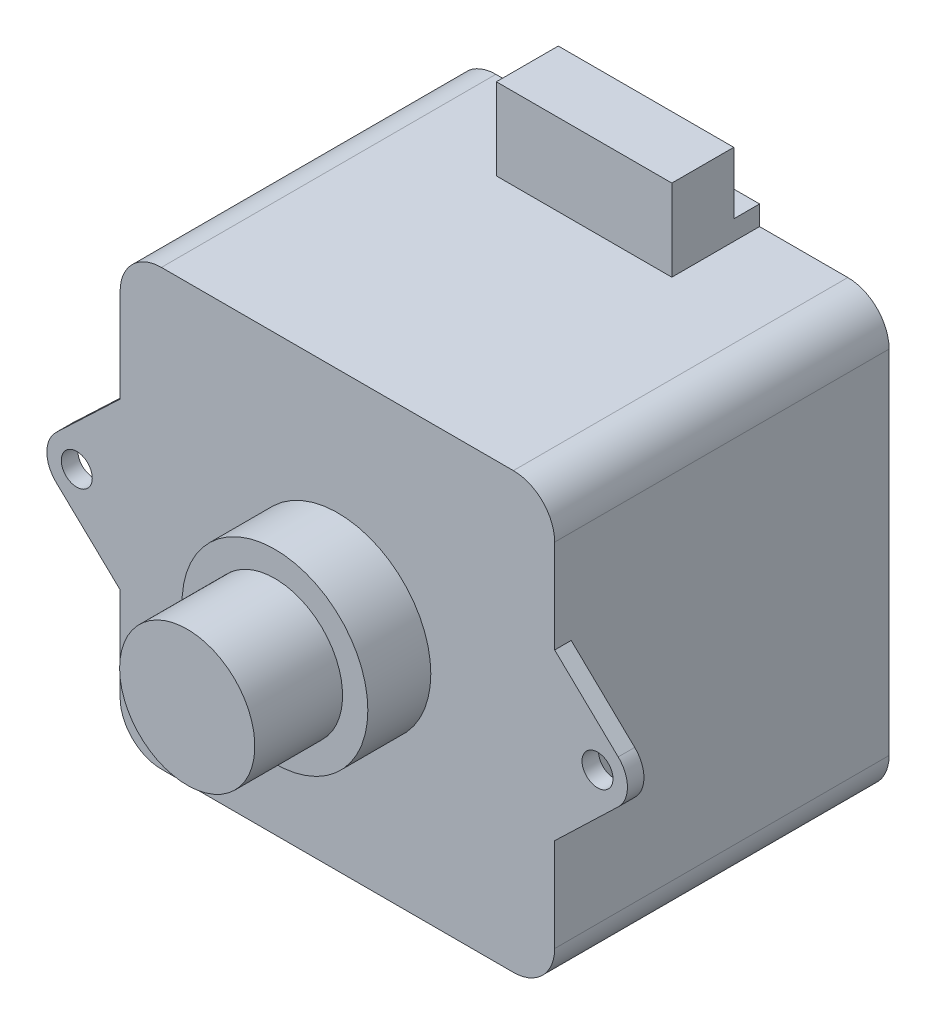
ISO-10303-21;
HEADER;
FILE_DESCRIPTION(('STEP AP214'),'2;1');
FILE_NAME('part.step','',(''),(''),'','','');
FILE_SCHEMA(('AUTOMOTIVE_DESIGN { 1 0 10303 214 1 1 1 1 }'));
ENDSEC;
DATA;
#1=APPLICATION_CONTEXT('core data for automotive mechanical design processes');
#2=APPLICATION_PROTOCOL_DEFINITION('international standard','automotive_design',2000,#1);
#3=PRODUCT_CONTEXT('',#1,'mechanical');
#4=PRODUCT('Part','Part','',(#3));
#5=PRODUCT_RELATED_PRODUCT_CATEGORY('part','',(#4));
#6=PRODUCT_DEFINITION_FORMATION('','',#4);
#7=PRODUCT_DEFINITION_CONTEXT('part definition',#1,'design');
#8=PRODUCT_DEFINITION('design','',#6,#7);
#9=PRODUCT_DEFINITION_SHAPE('','',#8);
#10=(LENGTH_UNIT() NAMED_UNIT(*) SI_UNIT(.MILLI.,.METRE.));
#11=(NAMED_UNIT(*) PLANE_ANGLE_UNIT() SI_UNIT($,.RADIAN.));
#12=(NAMED_UNIT(*) SI_UNIT($,.STERADIAN.) SOLID_ANGLE_UNIT());
#13=UNCERTAINTY_MEASURE_WITH_UNIT(LENGTH_MEASURE(1.E-05),#10,'distance_accuracy_value','');
#14=(GEOMETRIC_REPRESENTATION_CONTEXT(3) GLOBAL_UNCERTAINTY_ASSIGNED_CONTEXT((#13)) GLOBAL_UNIT_ASSIGNED_CONTEXT((#10,
#11,#12)) REPRESENTATION_CONTEXT('',''));
#15=CARTESIAN_POINT('',(0.,0.,0.));
#16=DIRECTION('',(0.,0.,1.));
#17=DIRECTION('',(1.,0.,0.));
#18=AXIS2_PLACEMENT_3D('',#15,#16,#17);
#19=CARTESIAN_POINT('',(-42.1,0.,32.4));
#20=DIRECTION('',(1.,0.,0.));
#21=DIRECTION('',(0.,0.,-1.));
#22=AXIS2_PLACEMENT_3D('',#19,#20,#21);
#23=PLANE('',#22);
#24=DIRECTION('',(0.,-1.,0.));
#25=VECTOR('',#24,1.);
#26=CARTESIAN_POINT('',(-42.1,0.,0.));
#27=LINE('',#26,#25);
#28=CARTESIAN_POINT('',(-42.1,38.1,0.));
#29=VERTEX_POINT('',#28);
#30=CARTESIAN_POINT('',(-42.1,4.,0.));
#31=VERTEX_POINT('',#30);
#32=EDGE_CURVE('E193',#29,#31,#27,.T.);
#33=ORIENTED_EDGE('',*,*,#32,.T.);
#34=DIRECTION('',(0.,0.,-1.));
#35=VECTOR('',#34,1.);
#36=CARTESIAN_POINT('',(-42.1,4.,40.));
#37=LINE('',#36,#35);
#38=CARTESIAN_POINT('',(-42.1,4.,32.4));
#39=VERTEX_POINT('',#38);
#40=EDGE_CURVE('E57',#39,#31,#37,.T.);
#41=ORIENTED_EDGE('',*,*,#40,.F.);
#42=DIRECTION('',(0.,-1.,0.));
#43=VECTOR('',#42,1.);
#44=CARTESIAN_POINT('',(-42.1,0.,32.4));
#45=LINE('',#44,#43);
#46=CARTESIAN_POINT('',(-42.1,13.05,32.4));
#47=VERTEX_POINT('',#46);
#48=EDGE_CURVE('E309',#47,#39,#45,.T.);
#49=ORIENTED_EDGE('',*,*,#48,.F.);
#50=DIRECTION('',(0.,0.,1.));
#51=VECTOR('',#50,1.);
#52=CARTESIAN_POINT('',(-42.1,13.05,30.8));
#53=LINE('',#52,#51);
#54=CARTESIAN_POINT('',(-42.1,13.05,30.8));
#55=VERTEX_POINT('',#54);
#56=EDGE_CURVE('E268',#55,#47,#53,.T.);
#57=ORIENTED_EDGE('',*,*,#56,.F.);
#58=DIRECTION('',(0.,-1.,0.));
#59=VECTOR('',#58,1.);
#60=CARTESIAN_POINT('',(-42.1,21.05,30.8));
#61=LINE('',#60,#59);
#62=CARTESIAN_POINT('',(-42.1,29.05,30.8));
#63=VERTEX_POINT('',#62);
#64=EDGE_CURVE('E265',#63,#55,#61,.T.);
#65=ORIENTED_EDGE('',*,*,#64,.F.);
#66=DIRECTION('',(0.,0.,-1.));
#67=VECTOR('',#66,1.);
#68=CARTESIAN_POINT('',(-42.1,29.05,32.4));
#69=LINE('',#68,#67);
#70=CARTESIAN_POINT('',(-42.1,29.05,32.4));
#71=VERTEX_POINT('',#70);
#72=EDGE_CURVE('E217',#71,#63,#69,.T.);
#73=ORIENTED_EDGE('',*,*,#72,.F.);
#74=CARTESIAN_POINT('',(-42.1,38.1,32.4));
#75=VERTEX_POINT('',#74);
#76=EDGE_CURVE('E195',#75,#71,#45,.T.);
#77=ORIENTED_EDGE('',*,*,#76,.F.);
#78=DIRECTION('',(0.,0.,-1.));
#79=VECTOR('',#78,1.);
#80=CARTESIAN_POINT('',(-42.1,38.1,40.));
#81=LINE('',#80,#79);
#82=EDGE_CURVE('E183',#75,#29,#81,.T.);
#83=ORIENTED_EDGE('',*,*,#82,.T.);
#84=EDGE_LOOP('',(#33,#41,#49,#57,#65,#73,#77,#83));
#85=FACE_BOUND('',#84,.T.);
#86=ADVANCED_FACE('F33',(#85),#23,.F.);
#87=CARTESIAN_POINT('',(0.,0.,32.4));
#88=DIRECTION('',(-1.,0.,0.));
#89=DIRECTION('',(0.,-1.,0.));
#90=AXIS2_PLACEMENT_3D('',#87,#88,#89);
#91=PLANE('',#90);
#92=DIRECTION('',(0.,1.,0.));
#93=VECTOR('',#92,1.);
#94=CARTESIAN_POINT('',(0.,0.,0.));
#95=LINE('',#94,#93);
#96=CARTESIAN_POINT('',(0.,4.,0.));
#97=VERTEX_POINT('',#96);
#98=CARTESIAN_POINT('',(0.,38.1,0.));
#99=VERTEX_POINT('',#98);
#100=EDGE_CURVE('E303',#97,#99,#95,.T.);
#101=ORIENTED_EDGE('',*,*,#100,.T.);
#102=DIRECTION('',(0.,0.,-1.));
#103=VECTOR('',#102,1.);
#104=CARTESIAN_POINT('',(0.,38.1,40.));
#105=LINE('',#104,#103);
#106=CARTESIAN_POINT('',(0.,38.1,32.4));
#107=VERTEX_POINT('',#106);
#108=EDGE_CURVE('E390',#107,#99,#105,.T.);
#109=ORIENTED_EDGE('',*,*,#108,.F.);
#110=DIRECTION('',(0.,1.,0.));
#111=VECTOR('',#110,1.);
#112=CARTESIAN_POINT('',(0.,0.,32.4));
#113=LINE('',#112,#111);
#114=CARTESIAN_POINT('',(0.,29.05,32.4));
#115=VERTEX_POINT('',#114);
#116=EDGE_CURVE('E204',#115,#107,#113,.T.);
#117=ORIENTED_EDGE('',*,*,#116,.F.);
#118=DIRECTION('',(0.,0.,1.));
#119=VECTOR('',#118,1.);
#120=CARTESIAN_POINT('',(0.,29.05,32.4));
#121=LINE('',#120,#119);
#122=CARTESIAN_POINT('',(0.,29.05,30.8));
#123=VERTEX_POINT('',#122);
#124=EDGE_CURVE('E274',#123,#115,#121,.T.);
#125=ORIENTED_EDGE('',*,*,#124,.F.);
#126=DIRECTION('',(0.,1.,0.));
#127=VECTOR('',#126,1.);
#128=CARTESIAN_POINT('',(0.,21.05,30.8));
#129=LINE('',#128,#127);
#130=CARTESIAN_POINT('',(0.,13.05,30.8));
#131=VERTEX_POINT('',#130);
#132=EDGE_CURVE('E272',#131,#123,#129,.T.);
#133=ORIENTED_EDGE('',*,*,#132,.F.);
#134=DIRECTION('',(0.,0.,-1.));
#135=VECTOR('',#134,1.);
#136=CARTESIAN_POINT('',(0.,13.05,32.4));
#137=LINE('',#136,#135);
#138=CARTESIAN_POINT('',(0.,13.05,32.4));
#139=VERTEX_POINT('',#138);
#140=EDGE_CURVE('E270',#139,#131,#137,.T.);
#141=ORIENTED_EDGE('',*,*,#140,.F.);
#142=CARTESIAN_POINT('',(0.,4.,32.4));
#143=VERTEX_POINT('',#142);
#144=EDGE_CURVE('E304',#143,#139,#113,.T.);
#145=ORIENTED_EDGE('',*,*,#144,.F.);
#146=DIRECTION('',(0.,0.,-1.));
#147=VECTOR('',#146,1.);
#148=CARTESIAN_POINT('',(0.,4.,40.));
#149=LINE('',#148,#147);
#150=EDGE_CURVE('E412',#143,#97,#149,.T.);
#151=ORIENTED_EDGE('',*,*,#150,.T.);
#152=EDGE_LOOP('',(#101,#109,#117,#125,#133,#141,#145,#151));
#153=FACE_BOUND('',#152,.T.);
#154=ADVANCED_FACE('F35',(#153),#91,.F.);
#155=CARTESIAN_POINT('',(0.,42.1,32.4));
#156=DIRECTION('',(0.,-1.,0.));
#157=DIRECTION('',(1.,0.,0.));
#158=AXIS2_PLACEMENT_3D('',#155,#156,#157);
#159=PLANE('',#158);
#160=DIRECTION('',(0.,0.,-1.));
#161=VECTOR('',#160,1.);
#162=CARTESIAN_POINT('',(-4.,42.1,40.));
#163=LINE('',#162,#161);
#164=CARTESIAN_POINT('',(-4.,42.1,32.4));
#165=VERTEX_POINT('',#164);
#166=CARTESIAN_POINT('',(-4.,42.1,0.));
#167=VERTEX_POINT('',#166);
#168=EDGE_CURVE('E388',#165,#167,#163,.T.);
#169=ORIENTED_EDGE('',*,*,#168,.T.);
#170=DIRECTION('',(-1.,0.,0.));
#171=VECTOR('',#170,1.);
#172=CARTESIAN_POINT('',(0.,42.1,0.));
#173=LINE('',#172,#171);
#174=CARTESIAN_POINT('',(-12.55,42.1,0.));
#175=VERTEX_POINT('',#174);
#176=EDGE_CURVE('E201',#167,#175,#173,.T.);
#177=ORIENTED_EDGE('',*,*,#176,.T.);
#178=DIRECTION('',(0.,0.,-1.));
#179=VECTOR('',#178,1.);
#180=CARTESIAN_POINT('',(-12.55,42.1,0.));
#181=LINE('',#180,#179);
#182=CARTESIAN_POINT('',(-12.55,42.1,8.5));
#183=VERTEX_POINT('',#182);
#184=EDGE_CURVE('E280',#183,#175,#181,.T.);
#185=ORIENTED_EDGE('',*,*,#184,.F.);
#186=DIRECTION('',(1.,0.,0.));
#187=VECTOR('',#186,1.);
#188=CARTESIAN_POINT('',(-29.55,42.1,8.5));
#189=LINE('',#188,#187);
#190=CARTESIAN_POINT('',(-29.55,42.1,8.5));
#191=VERTEX_POINT('',#190);
#192=EDGE_CURVE('E288',#191,#183,#189,.T.);
#193=ORIENTED_EDGE('',*,*,#192,.F.);
#194=DIRECTION('',(0.,0.,1.));
#195=VECTOR('',#194,1.);
#196=CARTESIAN_POINT('',(-29.55,42.1,0.));
#197=LINE('',#196,#195);
#198=CARTESIAN_POINT('',(-29.55,42.1,0.));
#199=VERTEX_POINT('',#198);
#200=EDGE_CURVE('E276',#199,#191,#197,.T.);
#201=ORIENTED_EDGE('',*,*,#200,.F.);
#202=CARTESIAN_POINT('',(-38.1,42.1,0.));
#203=VERTEX_POINT('',#202);
#204=EDGE_CURVE('E206',#199,#203,#173,.T.);
#205=ORIENTED_EDGE('',*,*,#204,.T.);
#206=DIRECTION('',(0.,0.,-1.));
#207=VECTOR('',#206,1.);
#208=CARTESIAN_POINT('',(-38.1,42.1,40.));
#209=LINE('',#208,#207);
#210=CARTESIAN_POINT('',(-38.1,42.1,32.4));
#211=VERTEX_POINT('',#210);
#212=EDGE_CURVE('E49',#211,#203,#209,.T.);
#213=ORIENTED_EDGE('',*,*,#212,.F.);
#214=DIRECTION('',(-1.,0.,0.));
#215=VECTOR('',#214,1.);
#216=CARTESIAN_POINT('',(0.,42.1,32.4));
#217=LINE('',#216,#215);
#218=EDGE_CURVE('E306',#165,#211,#217,.T.);
#219=ORIENTED_EDGE('',*,*,#218,.F.);
#220=EDGE_LOOP('',(#169,#177,#185,#193,#201,#205,#213,#219));
#221=FACE_BOUND('',#220,.T.);
#222=ADVANCED_FACE('F320',(#221),#159,.F.);
#223=CARTESIAN_POINT('',(0.,0.,32.4));
#224=DIRECTION('',(0.,1.,0.));
#225=DIRECTION('',(0.,0.,1.));
#226=AXIS2_PLACEMENT_3D('',#223,#224,#225);
#227=PLANE('',#226);
#228=DIRECTION('',(0.,0.,-1.));
#229=VECTOR('',#228,1.);
#230=CARTESIAN_POINT('',(-38.1,0.,40.));
#231=LINE('',#230,#229);
#232=CARTESIAN_POINT('',(-38.1,0.,32.4));
#233=VERTEX_POINT('',#232);
#234=CARTESIAN_POINT('',(-38.1,0.,0.));
#235=VERTEX_POINT('',#234);
#236=EDGE_CURVE('E420',#233,#235,#231,.T.);
#237=ORIENTED_EDGE('',*,*,#236,.T.);
#238=DIRECTION('',(1.,0.,0.));
#239=VECTOR('',#238,1.);
#240=CARTESIAN_POINT('',(0.,0.,0.));
#241=LINE('',#240,#239);
#242=CARTESIAN_POINT('',(-4.,0.,0.));
#243=VERTEX_POINT('',#242);
#244=EDGE_CURVE('E200',#235,#243,#241,.T.);
#245=ORIENTED_EDGE('',*,*,#244,.T.);
#246=DIRECTION('',(0.,0.,-1.));
#247=VECTOR('',#246,1.);
#248=CARTESIAN_POINT('',(-4.,0.,40.));
#249=LINE('',#248,#247);
#250=CARTESIAN_POINT('',(-4.,0.,32.4));
#251=VERTEX_POINT('',#250);
#252=EDGE_CURVE('E413',#251,#243,#249,.T.);
#253=ORIENTED_EDGE('',*,*,#252,.F.);
#254=DIRECTION('',(1.,0.,0.));
#255=VECTOR('',#254,1.);
#256=CARTESIAN_POINT('',(0.,0.,32.4));
#257=LINE('',#256,#255);
#258=EDGE_CURVE('E222',#233,#251,#257,.T.);
#259=ORIENTED_EDGE('',*,*,#258,.F.);
#260=EDGE_LOOP('',(#237,#245,#253,#259));
#261=FACE_BOUND('',#260,.T.);
#262=ADVANCED_FACE('F428',(#261),#227,.F.);
#263=CARTESIAN_POINT('',(0.,0.,32.4));
#264=DIRECTION('',(0.,0.,1.));
#265=DIRECTION('',(1.,0.,0.));
#266=AXIS2_PLACEMENT_3D('',#263,#264,#265);
#267=PLANE('',#266);
#268=CARTESIAN_POINT('',(-21.,21.05,32.4));
#269=DIRECTION('',(0.,0.,1.));
#270=DIRECTION('',(1.,0.,0.));
#271=AXIS2_PLACEMENT_3D('',#268,#269,#270);
#272=CIRCLE('',#271,9.);
#273=CARTESIAN_POINT('',(-12.,21.05,32.4));
#274=VERTEX_POINT('',#273);
#275=EDGE_CURVE('E350',#274,#274,#272,.T.);
#276=ORIENTED_EDGE('',*,*,#275,.F.);
#277=EDGE_LOOP('',(#276));
#278=FACE_BOUND('',#277,.T.);
#279=CARTESIAN_POINT('',(-46.3,21.0607022985956,32.4));
#280=DIRECTION('',(0.,0.,1.));
#281=DIRECTION('',(1.,0.,0.));
#282=AXIS2_PLACEMENT_3D('',#279,#280,#281);
#283=CIRCLE('',#282,1.5);
#284=CARTESIAN_POINT('',(-44.8,21.0607022985956,32.4));
#285=VERTEX_POINT('',#284);
#286=EDGE_CURVE('E214',#285,#285,#283,.T.);
#287=ORIENTED_EDGE('',*,*,#286,.F.);
#288=EDGE_LOOP('',(#287));
#289=FACE_BOUND('',#288,.T.);
#290=CARTESIAN_POINT('',(4.15,21.0607022985956,32.4));
#291=DIRECTION('',(0.,0.,1.));
#292=DIRECTION('',(1.,0.,0.));
#293=AXIS2_PLACEMENT_3D('',#290,#291,#292);
#294=CIRCLE('',#293,1.5);
#295=CARTESIAN_POINT('',(5.65,21.0607022985956,32.4));
#296=VERTEX_POINT('',#295);
#297=EDGE_CURVE('E259',#296,#296,#294,.T.);
#298=ORIENTED_EDGE('',*,*,#297,.F.);
#299=EDGE_LOOP('',(#298));
#300=FACE_BOUND('',#299,.T.);
#301=CARTESIAN_POINT('',(-38.1,4.,32.4));
#302=DIRECTION('',(0.,0.,1.));
#303=DIRECTION('',(1.,0.,0.));
#304=AXIS2_PLACEMENT_3D('',#301,#302,#303);
#305=CIRCLE('',#304,4.00000000000001);
#306=EDGE_CURVE('E346',#233,#39,#305,.F.);
#307=ORIENTED_EDGE('',*,*,#306,.F.);
#308=ORIENTED_EDGE('',*,*,#258,.T.);
#309=CARTESIAN_POINT('',(-4.,4.,32.4));
#310=DIRECTION('',(0.,0.,1.));
#311=DIRECTION('',(1.,0.,0.));
#312=AXIS2_PLACEMENT_3D('',#309,#310,#311);
#313=CIRCLE('',#312,4.);
#314=EDGE_CURVE('E410',#143,#251,#313,.F.);
#315=ORIENTED_EDGE('',*,*,#314,.F.);
#316=ORIENTED_EDGE('',*,*,#144,.T.);
#317=DIRECTION('',(-0.720997092131142,-0.692938087521848,0.));
#318=VECTOR('',#317,1.);
#319=CARTESIAN_POINT('',(0.,13.05,32.4));
#320=LINE('',#319,#318);
#321=CARTESIAN_POINT('',(6.15952045381336,18.9698107314153,32.4));
#322=VERTEX_POINT('',#321);
#323=EDGE_CURVE('E246',#322,#139,#320,.T.);
#324=ORIENTED_EDGE('',*,*,#323,.F.);
#325=CARTESIAN_POINT('',(4.15,21.0607022985956,32.4));
#326=DIRECTION('',(0.,0.,-1.));
#327=DIRECTION('',(1.,0.,0.));
#328=AXIS2_PLACEMENT_3D('',#325,#326,#327);
#329=CIRCLE('',#328,2.9);
#330=CARTESIAN_POINT('',(6.15573233203672,23.1552279757412,32.4));
#331=VERTEX_POINT('',#330);
#332=EDGE_CURVE('E251',#331,#322,#329,.T.);
#333=ORIENTED_EDGE('',*,*,#332,.F.);
#334=DIRECTION('',(0.722250233498506,-0.691631838633354,0.));
#335=VECTOR('',#334,1.);
#336=CARTESIAN_POINT('',(0.,29.05,32.4));
#337=LINE('',#336,#335);
#338=EDGE_CURVE('E244',#115,#331,#337,.T.);
#339=ORIENTED_EDGE('',*,*,#338,.F.);
#340=ORIENTED_EDGE('',*,*,#116,.T.);
#341=CARTESIAN_POINT('',(-4.,38.1,32.4));
#342=DIRECTION('',(0.,0.,1.));
#343=DIRECTION('',(1.,0.,0.));
#344=AXIS2_PLACEMENT_3D('',#341,#342,#343);
#345=CIRCLE('',#344,4.);
#346=EDGE_CURVE('E384',#165,#107,#345,.F.);
#347=ORIENTED_EDGE('',*,*,#346,.F.);
#348=ORIENTED_EDGE('',*,*,#218,.T.);
#349=CARTESIAN_POINT('',(-38.1,38.1,32.4));
#350=DIRECTION('',(0.,0.,1.));
#351=DIRECTION('',(1.,0.,0.));
#352=AXIS2_PLACEMENT_3D('',#349,#350,#351);
#353=CIRCLE('',#352,4.);
#354=EDGE_CURVE('E386',#75,#211,#353,.F.);
#355=ORIENTED_EDGE('',*,*,#354,.F.);
#356=ORIENTED_EDGE('',*,*,#76,.T.);
#357=DIRECTION('',(0.725040642809056,0.688706081195041,0.));
#358=VECTOR('',#357,1.);
#359=CARTESIAN_POINT('',(-42.1,29.05,32.4));
#360=LINE('',#359,#358);
#361=CARTESIAN_POINT('',(-48.2972476354656,23.1633201627418,32.4));
#362=VERTEX_POINT('',#361);
#363=EDGE_CURVE('E365',#362,#71,#360,.T.);
#364=ORIENTED_EDGE('',*,*,#363,.F.);
#365=CARTESIAN_POINT('',(-46.3,21.0607022985956,32.4));
#366=DIRECTION('',(0.,0.,-1.));
#367=DIRECTION('',(1.,0.,0.));
#368=AXIS2_PLACEMENT_3D('',#365,#366,#367);
#369=CIRCLE('',#368,2.90000000000001);
#370=CARTESIAN_POINT('',(-48.301054233602,18.9617068354791,32.4));
#371=VERTEX_POINT('',#370);
#372=EDGE_CURVE('E362',#371,#362,#369,.T.);
#373=ORIENTED_EDGE('',*,*,#372,.F.);
#374=DIRECTION('',(-0.723791539005669,0.690018701242079,0.));
#375=VECTOR('',#374,1.);
#376=CARTESIAN_POINT('',(-42.1,13.05,32.4));
#377=LINE('',#376,#375);
#378=EDGE_CURVE('E248',#47,#371,#377,.T.);
#379=ORIENTED_EDGE('',*,*,#378,.F.);
#380=ORIENTED_EDGE('',*,*,#48,.T.);
#381=EDGE_LOOP('',(#307,#308,#315,#316,#324,#333,#339,#340,#347,#348,#355,#356,#364,#373,#379,#380));
#382=FACE_BOUND('',#381,.T.);
#383=ADVANCED_FACE('F375',(#278,#289,#300,#382),#267,.T.);
#384=CARTESIAN_POINT('',(0.,0.,0.));
#385=DIRECTION('',(0.,0.,1.));
#386=DIRECTION('',(1.,0.,0.));
#387=AXIS2_PLACEMENT_3D('',#384,#385,#386);
#388=PLANE('',#387);
#389=ORIENTED_EDGE('',*,*,#244,.F.);
#390=CARTESIAN_POINT('',(-38.1,4.,0.));
#391=DIRECTION('',(0.,0.,1.));
#392=DIRECTION('',(-1.,0.,0.));
#393=AXIS2_PLACEMENT_3D('',#390,#391,#392);
#394=CIRCLE('',#393,4.00000000000001);
#395=EDGE_CURVE('E199',#31,#235,#394,.T.);
#396=ORIENTED_EDGE('',*,*,#395,.F.);
#397=ORIENTED_EDGE('',*,*,#32,.F.);
#398=CARTESIAN_POINT('',(-38.1,38.1,0.));
#399=DIRECTION('',(0.,0.,1.));
#400=DIRECTION('',(-1.,0.,0.));
#401=AXIS2_PLACEMENT_3D('',#398,#399,#400);
#402=CIRCLE('',#401,4.);
#403=EDGE_CURVE('E180',#203,#29,#402,.T.);
#404=ORIENTED_EDGE('',*,*,#403,.F.);
#405=ORIENTED_EDGE('',*,*,#204,.F.);
#406=DIRECTION('',(0.,-1.,0.));
#407=VECTOR('',#406,1.);
#408=CARTESIAN_POINT('',(-29.55,50.,0.));
#409=LINE('',#408,#407);
#410=CARTESIAN_POINT('',(-29.55,44.,0.));
#411=VERTEX_POINT('',#410);
#412=EDGE_CURVE('E285',#411,#199,#409,.T.);
#413=ORIENTED_EDGE('',*,*,#412,.F.);
#414=DIRECTION('',(-1.,0.,0.));
#415=VECTOR('',#414,1.);
#416=CARTESIAN_POINT('',(-12.55,44.,0.));
#417=LINE('',#416,#415);
#418=CARTESIAN_POINT('',(-12.55,44.,0.));
#419=VERTEX_POINT('',#418);
#420=EDGE_CURVE('E324',#419,#411,#417,.T.);
#421=ORIENTED_EDGE('',*,*,#420,.F.);
#422=DIRECTION('',(0.,-1.,0.));
#423=VECTOR('',#422,1.);
#424=CARTESIAN_POINT('',(-12.55,50.,0.));
#425=LINE('',#424,#423);
#426=EDGE_CURVE('E294',#419,#175,#425,.T.);
#427=ORIENTED_EDGE('',*,*,#426,.T.);
#428=ORIENTED_EDGE('',*,*,#176,.F.);
#429=CARTESIAN_POINT('',(-4.,38.1,0.));
#430=DIRECTION('',(0.,0.,1.));
#431=DIRECTION('',(-1.,0.,0.));
#432=AXIS2_PLACEMENT_3D('',#429,#430,#431);
#433=CIRCLE('',#432,4.);
#434=EDGE_CURVE('E391',#99,#167,#433,.T.);
#435=ORIENTED_EDGE('',*,*,#434,.F.);
#436=ORIENTED_EDGE('',*,*,#100,.F.);
#437=CARTESIAN_POINT('',(-4.,4.,0.));
#438=DIRECTION('',(0.,0.,1.));
#439=DIRECTION('',(-1.,0.,0.));
#440=AXIS2_PLACEMENT_3D('',#437,#438,#439);
#441=CIRCLE('',#440,4.);
#442=EDGE_CURVE('E415',#243,#97,#441,.T.);
#443=ORIENTED_EDGE('',*,*,#442,.F.);
#444=EDGE_LOOP('',(#389,#396,#397,#404,#405,#413,#421,#427,#428,#435,#436,#443));
#445=FACE_BOUND('',#444,.T.);
#446=ADVANCED_FACE('F198',(#445),#388,.F.);
#447=CARTESIAN_POINT('',(-29.55,50.,0.));
#448=DIRECTION('',(1.,0.,0.));
#449=DIRECTION('',(0.,1.,0.));
#450=AXIS2_PLACEMENT_3D('',#447,#448,#449);
#451=PLANE('',#450);
#452=DIRECTION('',(0.,0.,1.));
#453=VECTOR('',#452,1.);
#454=CARTESIAN_POINT('',(-29.55,50.,0.));
#455=LINE('',#454,#453);
#456=CARTESIAN_POINT('',(-29.55,50.,2.5));
#457=VERTEX_POINT('',#456);
#458=CARTESIAN_POINT('',(-29.55,50.,8.5));
#459=VERTEX_POINT('',#458);
#460=EDGE_CURVE('E277',#457,#459,#455,.T.);
#461=ORIENTED_EDGE('',*,*,#460,.F.);
#462=DIRECTION('',(0.,1.,0.));
#463=VECTOR('',#462,1.);
#464=CARTESIAN_POINT('',(-29.55,44.,2.5));
#465=LINE('',#464,#463);
#466=CARTESIAN_POINT('',(-29.55,44.,2.5));
#467=VERTEX_POINT('',#466);
#468=EDGE_CURVE('E333',#467,#457,#465,.T.);
#469=ORIENTED_EDGE('',*,*,#468,.F.);
#470=DIRECTION('',(0.,0.,1.));
#471=VECTOR('',#470,1.);
#472=CARTESIAN_POINT('',(-29.55,44.,0.));
#473=LINE('',#472,#471);
#474=EDGE_CURVE('E332',#411,#467,#473,.T.);
#475=ORIENTED_EDGE('',*,*,#474,.F.);
#476=ORIENTED_EDGE('',*,*,#412,.T.);
#477=ORIENTED_EDGE('',*,*,#200,.T.);
#478=DIRECTION('',(0.,-1.,0.));
#479=VECTOR('',#478,1.);
#480=CARTESIAN_POINT('',(-29.55,50.,8.5));
#481=LINE('',#480,#479);
#482=EDGE_CURVE('E300',#459,#191,#481,.T.);
#483=ORIENTED_EDGE('',*,*,#482,.F.);
#484=EDGE_LOOP('',(#461,#469,#475,#476,#477,#483));
#485=FACE_BOUND('',#484,.T.);
#486=ADVANCED_FACE('F329',(#485),#451,.F.);
#487=CARTESIAN_POINT('',(-29.55,50.,8.5));
#488=DIRECTION('',(0.,0.,-1.));
#489=DIRECTION('',(-1.,0.,0.));
#490=AXIS2_PLACEMENT_3D('',#487,#488,#489);
#491=PLANE('',#490);
#492=ORIENTED_EDGE('',*,*,#192,.T.);
#493=DIRECTION('',(0.,-1.,0.));
#494=VECTOR('',#493,1.);
#495=CARTESIAN_POINT('',(-12.55,50.,8.5));
#496=LINE('',#495,#494);
#497=CARTESIAN_POINT('',(-12.55,50.,8.5));
#498=VERTEX_POINT('',#497);
#499=EDGE_CURVE('E297',#498,#183,#496,.T.);
#500=ORIENTED_EDGE('',*,*,#499,.F.);
#501=DIRECTION('',(1.,0.,0.));
#502=VECTOR('',#501,1.);
#503=CARTESIAN_POINT('',(-29.55,50.,8.5));
#504=LINE('',#503,#502);
#505=EDGE_CURVE('E279',#459,#498,#504,.T.);
#506=ORIENTED_EDGE('',*,*,#505,.F.);
#507=ORIENTED_EDGE('',*,*,#482,.T.);
#508=EDGE_LOOP('',(#492,#500,#506,#507));
#509=FACE_BOUND('',#508,.T.);
#510=ADVANCED_FACE('F400',(#509),#491,.F.);
#511=CARTESIAN_POINT('',(-12.55,50.,0.));
#512=DIRECTION('',(-1.,0.,0.));
#513=DIRECTION('',(0.,0.,1.));
#514=AXIS2_PLACEMENT_3D('',#511,#512,#513);
#515=PLANE('',#514);
#516=DIRECTION('',(0.,0.,-1.));
#517=VECTOR('',#516,1.);
#518=CARTESIAN_POINT('',(-12.55,44.,0.));
#519=LINE('',#518,#517);
#520=CARTESIAN_POINT('',(-12.55,44.,2.5));
#521=VERTEX_POINT('',#520);
#522=EDGE_CURVE('E340',#521,#419,#519,.T.);
#523=ORIENTED_EDGE('',*,*,#522,.F.);
#524=DIRECTION('',(0.,1.,0.));
#525=VECTOR('',#524,1.);
#526=CARTESIAN_POINT('',(-12.55,44.,2.5));
#527=LINE('',#526,#525);
#528=CARTESIAN_POINT('',(-12.55,50.,2.5));
#529=VERTEX_POINT('',#528);
#530=EDGE_CURVE('E347',#521,#529,#527,.T.);
#531=ORIENTED_EDGE('',*,*,#530,.T.);
#532=DIRECTION('',(0.,0.,-1.));
#533=VECTOR('',#532,1.);
#534=CARTESIAN_POINT('',(-12.55,50.,0.));
#535=LINE('',#534,#533);
#536=EDGE_CURVE('E282',#498,#529,#535,.T.);
#537=ORIENTED_EDGE('',*,*,#536,.F.);
#538=ORIENTED_EDGE('',*,*,#499,.T.);
#539=ORIENTED_EDGE('',*,*,#184,.T.);
#540=ORIENTED_EDGE('',*,*,#426,.F.);
#541=EDGE_LOOP('',(#523,#531,#537,#538,#539,#540));
#542=FACE_BOUND('',#541,.T.);
#543=ADVANCED_FACE('F396',(#542),#515,.F.);
#544=CARTESIAN_POINT('',(0.,50.,0.));
#545=DIRECTION('',(0.,1.,0.));
#546=DIRECTION('',(-1.,0.,0.));
#547=AXIS2_PLACEMENT_3D('',#544,#545,#546);
#548=PLANE('',#547);
#549=DIRECTION('',(1.,0.,0.));
#550=VECTOR('',#549,1.);
#551=CARTESIAN_POINT('',(-12.55,50.,2.5));
#552=LINE('',#551,#550);
#553=EDGE_CURVE('E344',#457,#529,#552,.T.);
#554=ORIENTED_EDGE('',*,*,#553,.F.);
#555=ORIENTED_EDGE('',*,*,#460,.T.);
#556=ORIENTED_EDGE('',*,*,#505,.T.);
#557=ORIENTED_EDGE('',*,*,#536,.T.);
#558=EDGE_LOOP('',(#554,#555,#556,#557));
#559=FACE_BOUND('',#558,.T.);
#560=ADVANCED_FACE('F404',(#559),#548,.T.);
#561=CARTESIAN_POINT('',(7.15,21.05,30.8));
#562=DIRECTION('',(0.,0.,1.));
#563=DIRECTION('',(0.,-1.,0.));
#564=AXIS2_PLACEMENT_3D('',#561,#562,#563);
#565=PLANE('',#564);
#566=CARTESIAN_POINT('',(4.15,21.0607022985956,30.8));
#567=DIRECTION('',(0.,0.,1.));
#568=DIRECTION('',(0.,-1.,0.));
#569=AXIS2_PLACEMENT_3D('',#566,#567,#568);
#570=CIRCLE('',#569,1.5);
#571=CARTESIAN_POINT('',(4.15,19.5607022985956,30.8));
#572=VERTEX_POINT('',#571);
#573=EDGE_CURVE('E213',#572,#572,#570,.T.);
#574=ORIENTED_EDGE('',*,*,#573,.T.);
#575=EDGE_LOOP('',(#574));
#576=FACE_BOUND('',#575,.T.);
#577=CARTESIAN_POINT('',(4.15,21.0607022985956,30.8));
#578=DIRECTION('',(0.,0.,1.));
#579=DIRECTION('',(0.,-1.,0.));
#580=AXIS2_PLACEMENT_3D('',#577,#578,#579);
#581=CIRCLE('',#580,2.9);
#582=CARTESIAN_POINT('',(6.15573233203672,23.1552279757412,30.8));
#583=VERTEX_POINT('',#582);
#584=CARTESIAN_POINT('',(6.15952045381336,18.9698107314153,30.8));
#585=VERTEX_POINT('',#584);
#586=EDGE_CURVE('E42',#583,#585,#581,.F.);
#587=ORIENTED_EDGE('',*,*,#586,.T.);
#588=DIRECTION('',(-0.720997092131142,-0.692938087521848,0.));
#589=VECTOR('',#588,1.);
#590=CARTESIAN_POINT('',(7.71368393810152,20.4634909199382,30.8));
#591=LINE('',#590,#589);
#592=EDGE_CURVE('E11',#585,#131,#591,.T.);
#593=ORIENTED_EDGE('',*,*,#592,.T.);
#594=ORIENTED_EDGE('',*,*,#132,.T.);
#595=DIRECTION('',(0.722250233498506,-0.691631838633354,0.));
#596=VECTOR('',#595,1.);
#597=CARTESIAN_POINT('',(7.72601466407234,21.6515147111314,30.8));
#598=LINE('',#597,#596);
#599=EDGE_CURVE('E231',#123,#583,#598,.T.);
#600=ORIENTED_EDGE('',*,*,#599,.T.);
#601=EDGE_LOOP('',(#587,#593,#594,#600));
#602=FACE_BOUND('',#601,.T.);
#603=ADVANCED_FACE('F228',(#576,#602),#565,.F.);
#604=CARTESIAN_POINT('',(-49.3,21.05,30.8));
#605=DIRECTION('',(0.,0.,1.));
#606=DIRECTION('',(0.,-1.,0.));
#607=AXIS2_PLACEMENT_3D('',#604,#605,#606);
#608=PLANE('',#607);
#609=CARTESIAN_POINT('',(-46.3,21.0607022985956,30.8));
#610=DIRECTION('',(0.,0.,1.));
#611=DIRECTION('',(0.,-1.,0.));
#612=AXIS2_PLACEMENT_3D('',#609,#610,#611);
#613=CIRCLE('',#612,1.5);
#614=CARTESIAN_POINT('',(-46.3,19.5607022985956,30.8));
#615=VERTEX_POINT('',#614);
#616=EDGE_CURVE('E210',#615,#615,#613,.T.);
#617=ORIENTED_EDGE('',*,*,#616,.T.);
#618=EDGE_LOOP('',(#617));
#619=FACE_BOUND('',#618,.T.);
#620=CARTESIAN_POINT('',(-46.3,21.0607022985956,30.8));
#621=DIRECTION('',(0.,0.,1.));
#622=DIRECTION('',(0.,-1.,0.));
#623=AXIS2_PLACEMENT_3D('',#620,#621,#622);
#624=CIRCLE('',#623,2.90000000000001);
#625=CARTESIAN_POINT('',(-48.301054233602,18.9617068354791,30.8));
#626=VERTEX_POINT('',#625);
#627=CARTESIAN_POINT('',(-48.2972476354656,23.1633201627418,30.8));
#628=VERTEX_POINT('',#627);
#629=EDGE_CURVE('E218',#626,#628,#624,.F.);
#630=ORIENTED_EDGE('',*,*,#629,.T.);
#631=DIRECTION('',(0.725040642809056,0.688706081195041,0.));
#632=VECTOR('',#631,1.);
#633=CARTESIAN_POINT('',(-49.879643521349,21.6602241911234,30.8));
#634=LINE('',#633,#632);
#635=EDGE_CURVE('E221',#628,#63,#634,.T.);
#636=ORIENTED_EDGE('',*,*,#635,.T.);
#637=ORIENTED_EDGE('',*,*,#64,.T.);
#638=DIRECTION('',(-0.723791539005669,0.690018701242079,0.));
#639=VECTOR('',#638,1.);
#640=CARTESIAN_POINT('',(-49.8673317636582,20.4549002880563,30.8));
#641=LINE('',#640,#639);
#642=EDGE_CURVE('E254',#55,#626,#641,.T.);
#643=ORIENTED_EDGE('',*,*,#642,.T.);
#644=EDGE_LOOP('',(#630,#636,#637,#643));
#645=FACE_BOUND('',#644,.T.);
#646=ADVANCED_FACE('F440',(#619,#645),#608,.F.);
#647=CARTESIAN_POINT('',(-46.3,21.0607022985956,25.2));
#648=DIRECTION('',(0.,0.,1.));
#649=DIRECTION('',(1.,0.,0.));
#650=AXIS2_PLACEMENT_3D('',#647,#648,#649);
#651=CYLINDRICAL_SURFACE('',#650,1.5);
#652=ORIENTED_EDGE('',*,*,#286,.T.);
#653=EDGE_LOOP('',(#652));
#654=FACE_BOUND('',#653,.T.);
#655=ORIENTED_EDGE('',*,*,#616,.F.);
#656=EDGE_LOOP('',(#655));
#657=FACE_BOUND('',#656,.T.);
#658=ADVANCED_FACE('F494',(#654,#657),#651,.F.);
#659=CARTESIAN_POINT('',(4.15,21.0607022985956,25.2));
#660=DIRECTION('',(0.,0.,1.));
#661=DIRECTION('',(1.,0.,0.));
#662=AXIS2_PLACEMENT_3D('',#659,#660,#661);
#663=CYLINDRICAL_SURFACE('',#662,1.5);
#664=ORIENTED_EDGE('',*,*,#297,.T.);
#665=EDGE_LOOP('',(#664));
#666=FACE_BOUND('',#665,.T.);
#667=ORIENTED_EDGE('',*,*,#573,.F.);
#668=EDGE_LOOP('',(#667));
#669=FACE_BOUND('',#668,.T.);
#670=ADVANCED_FACE('F496',(#666,#669),#663,.F.);
#671=CARTESIAN_POINT('',(-42.1,29.05,25.2));
#672=DIRECTION('',(0.688706081195041,-0.725040642809056,0.));
#673=DIRECTION('',(0.725040642809056,0.688706081195041,0.));
#674=AXIS2_PLACEMENT_3D('',#671,#672,#673);
#675=PLANE('',#674);
#676=DIRECTION('',(0.,0.,1.));
#677=VECTOR('',#676,1.);
#678=CARTESIAN_POINT('',(-48.2972476354656,23.1633201627418,25.2));
#679=LINE('',#678,#677);
#680=EDGE_CURVE('E257',#628,#362,#679,.T.);
#681=ORIENTED_EDGE('',*,*,#680,.T.);
#682=ORIENTED_EDGE('',*,*,#363,.T.);
#683=ORIENTED_EDGE('',*,*,#72,.T.);
#684=ORIENTED_EDGE('',*,*,#635,.F.);
#685=EDGE_LOOP('',(#681,#682,#683,#684));
#686=FACE_BOUND('',#685,.T.);
#687=ADVANCED_FACE('F443',(#686),#675,.F.);
#688=CARTESIAN_POINT('',(-46.3,21.0607022985956,25.2));
#689=DIRECTION('',(0.,0.,1.));
#690=DIRECTION('',(1.,0.,0.));
#691=AXIS2_PLACEMENT_3D('',#688,#689,#690);
#692=CYLINDRICAL_SURFACE('',#691,2.90000000000001);
#693=DIRECTION('',(0.,0.,1.));
#694=VECTOR('',#693,1.);
#695=CARTESIAN_POINT('',(-48.301054233602,18.9617068354791,25.2));
#696=LINE('',#695,#694);
#697=EDGE_CURVE('E368',#626,#371,#696,.T.);
#698=ORIENTED_EDGE('',*,*,#697,.T.);
#699=ORIENTED_EDGE('',*,*,#372,.T.);
#700=ORIENTED_EDGE('',*,*,#680,.F.);
#701=ORIENTED_EDGE('',*,*,#629,.F.);
#702=EDGE_LOOP('',(#698,#699,#700,#701));
#703=FACE_BOUND('',#702,.T.);
#704=ADVANCED_FACE('F445',(#703),#692,.T.);
#705=CARTESIAN_POINT('',(-42.1,13.05,25.2));
#706=DIRECTION('',(0.690018701242079,0.723791539005669,0.));
#707=DIRECTION('',(-0.723791539005669,0.690018701242079,0.));
#708=AXIS2_PLACEMENT_3D('',#705,#706,#707);
#709=PLANE('',#708);
#710=ORIENTED_EDGE('',*,*,#56,.T.);
#711=ORIENTED_EDGE('',*,*,#378,.T.);
#712=ORIENTED_EDGE('',*,*,#697,.F.);
#713=ORIENTED_EDGE('',*,*,#642,.F.);
#714=EDGE_LOOP('',(#710,#711,#712,#713));
#715=FACE_BOUND('',#714,.T.);
#716=ADVANCED_FACE('F449',(#715),#709,.F.);
#717=CARTESIAN_POINT('',(0.,13.05,25.2));
#718=DIRECTION('',(-0.692938087521848,0.720997092131142,0.));
#719=DIRECTION('',(-0.720997092131142,-0.692938087521848,0.));
#720=AXIS2_PLACEMENT_3D('',#717,#718,#719);
#721=PLANE('',#720);
#722=DIRECTION('',(0.,0.,1.));
#723=VECTOR('',#722,1.);
#724=CARTESIAN_POINT('',(6.15952045381336,18.9698107314153,25.2));
#725=LINE('',#724,#723);
#726=EDGE_CURVE('E239',#585,#322,#725,.T.);
#727=ORIENTED_EDGE('',*,*,#726,.T.);
#728=ORIENTED_EDGE('',*,*,#323,.T.);
#729=ORIENTED_EDGE('',*,*,#140,.T.);
#730=ORIENTED_EDGE('',*,*,#592,.F.);
#731=EDGE_LOOP('',(#727,#728,#729,#730));
#732=FACE_BOUND('',#731,.T.);
#733=ADVANCED_FACE('F380',(#732),#721,.F.);
#734=CARTESIAN_POINT('',(4.15,21.0607022985956,25.2));
#735=DIRECTION('',(0.,0.,1.));
#736=DIRECTION('',(1.,0.,0.));
#737=AXIS2_PLACEMENT_3D('',#734,#735,#736);
#738=CYLINDRICAL_SURFACE('',#737,2.9);
#739=DIRECTION('',(0.,0.,1.));
#740=VECTOR('',#739,1.);
#741=CARTESIAN_POINT('',(6.15573233203672,23.1552279757412,25.2));
#742=LINE('',#741,#740);
#743=EDGE_CURVE('E237',#583,#331,#742,.T.);
#744=ORIENTED_EDGE('',*,*,#743,.T.);
#745=ORIENTED_EDGE('',*,*,#332,.T.);
#746=ORIENTED_EDGE('',*,*,#726,.F.);
#747=ORIENTED_EDGE('',*,*,#586,.F.);
#748=EDGE_LOOP('',(#744,#745,#746,#747));
#749=FACE_BOUND('',#748,.T.);
#750=ADVANCED_FACE('F235',(#749),#738,.T.);
#751=CARTESIAN_POINT('',(0.,29.05,25.2));
#752=DIRECTION('',(-0.691631838633354,-0.722250233498506,0.));
#753=DIRECTION('',(0.722250233498506,-0.691631838633354,0.));
#754=AXIS2_PLACEMENT_3D('',#751,#752,#753);
#755=PLANE('',#754);
#756=ORIENTED_EDGE('',*,*,#124,.T.);
#757=ORIENTED_EDGE('',*,*,#338,.T.);
#758=ORIENTED_EDGE('',*,*,#743,.F.);
#759=ORIENTED_EDGE('',*,*,#599,.F.);
#760=EDGE_LOOP('',(#756,#757,#758,#759));
#761=FACE_BOUND('',#760,.T.);
#762=ADVANCED_FACE('F241',(#761),#755,.F.);
#763=CARTESIAN_POINT('',(-21.,21.05,38.5));
#764=DIRECTION('',(0.,0.,-1.));
#765=DIRECTION('',(-1.,0.,0.));
#766=AXIS2_PLACEMENT_3D('',#763,#764,#765);
#767=CYLINDRICAL_SURFACE('',#766,9.);
#768=CARTESIAN_POINT('',(-21.,21.05,38.5));
#769=DIRECTION('',(0.,0.,1.));
#770=DIRECTION('',(1.,0.,0.));
#771=AXIS2_PLACEMENT_3D('',#768,#769,#770);
#772=CIRCLE('',#771,9.);
#773=CARTESIAN_POINT('',(-12.,21.05,38.5));
#774=VERTEX_POINT('',#773);
#775=EDGE_CURVE('E352',#774,#774,#772,.T.);
#776=ORIENTED_EDGE('',*,*,#775,.F.);
#777=EDGE_LOOP('',(#776));
#778=FACE_BOUND('',#777,.T.);
#779=ORIENTED_EDGE('',*,*,#275,.T.);
#780=EDGE_LOOP('',(#779));
#781=FACE_BOUND('',#780,.T.);
#782=ADVANCED_FACE('F505',(#778,#781),#767,.T.);
#783=CARTESIAN_POINT('',(-21.,21.05,38.5));
#784=DIRECTION('',(0.,0.,1.));
#785=DIRECTION('',(1.,0.,0.));
#786=AXIS2_PLACEMENT_3D('',#783,#784,#785);
#787=PLANE('',#786);
#788=CARTESIAN_POINT('',(-21.,21.05,38.5));
#789=DIRECTION('',(0.,0.,1.));
#790=DIRECTION('',(1.,0.,0.));
#791=AXIS2_PLACEMENT_3D('',#788,#789,#790);
#792=CIRCLE('',#791,6.55);
#793=CARTESIAN_POINT('',(-27.55,21.05,38.5));
#794=VERTEX_POINT('',#793);
#795=EDGE_CURVE('E37',#794,#794,#792,.T.);
#796=ORIENTED_EDGE('',*,*,#795,.F.);
#797=EDGE_LOOP('',(#796));
#798=FACE_BOUND('',#797,.T.);
#799=ORIENTED_EDGE('',*,*,#775,.T.);
#800=EDGE_LOOP('',(#799));
#801=FACE_BOUND('',#800,.T.);
#802=ADVANCED_FACE('F522',(#798,#801),#787,.T.);
#803=CARTESIAN_POINT('',(-21.,21.05,47.));
#804=DIRECTION('',(0.,0.,1.));
#805=DIRECTION('',(1.,0.,0.));
#806=AXIS2_PLACEMENT_3D('',#803,#804,#805);
#807=PLANE('',#806);
#808=CARTESIAN_POINT('',(-21.,21.05,47.));
#809=DIRECTION('',(0.,0.,1.));
#810=DIRECTION('',(1.,0.,0.));
#811=AXIS2_PLACEMENT_3D('',#808,#809,#810);
#812=CIRCLE('',#811,6.55);
#813=CARTESIAN_POINT('',(-27.55,21.05,47.));
#814=VERTEX_POINT('',#813);
#815=EDGE_CURVE('E357',#814,#814,#812,.T.);
#816=ORIENTED_EDGE('',*,*,#815,.T.);
#817=EDGE_LOOP('',(#816));
#818=FACE_BOUND('',#817,.T.);
#819=ADVANCED_FACE('F530',(#818),#807,.T.);
#820=CARTESIAN_POINT('',(-21.,21.05,47.));
#821=DIRECTION('',(0.,0.,-1.));
#822=DIRECTION('',(-1.,0.,0.));
#823=AXIS2_PLACEMENT_3D('',#820,#821,#822);
#824=CYLINDRICAL_SURFACE('',#823,6.55);
#825=CARTESIAN_POINT('',(-27.55,21.05,38.5));
#826=CARTESIAN_POINT('',(-27.55,21.05,38.5885416666667));
#827=CARTESIAN_POINT('',(-27.55,21.05,38.6770833333333));
#828=CARTESIAN_POINT('',(-27.55,21.05,38.8541666666667));
#829=CARTESIAN_POINT('',(-27.55,21.05,38.9427083333333));
#830=CARTESIAN_POINT('',(-27.55,21.05,39.1197916666667));
#831=CARTESIAN_POINT('',(-27.55,21.05,39.2083333333333));
#832=CARTESIAN_POINT('',(-27.55,21.05,39.3854166666667));
#833=CARTESIAN_POINT('',(-27.55,21.05,39.4739583333333));
#834=CARTESIAN_POINT('',(-27.55,21.05,39.6510416666667));
#835=CARTESIAN_POINT('',(-27.55,21.05,39.7395833333333));
#836=CARTESIAN_POINT('',(-27.55,21.05,39.9166666666667));
#837=CARTESIAN_POINT('',(-27.55,21.05,40.0052083333333));
#838=CARTESIAN_POINT('',(-27.55,21.05,40.1822916666667));
#839=CARTESIAN_POINT('',(-27.55,21.05,40.2708333333333));
#840=CARTESIAN_POINT('',(-27.55,21.05,40.4479166666667));
#841=CARTESIAN_POINT('',(-27.55,21.05,40.5364583333333));
#842=CARTESIAN_POINT('',(-27.55,21.05,40.7135416666667));
#843=CARTESIAN_POINT('',(-27.55,21.05,40.8020833333333));
#844=CARTESIAN_POINT('',(-27.55,21.05,40.9791666666667));
#845=CARTESIAN_POINT('',(-27.55,21.05,41.0677083333333));
#846=CARTESIAN_POINT('',(-27.55,21.05,41.2447916666667));
#847=CARTESIAN_POINT('',(-27.55,21.05,41.3333333333333));
#848=CARTESIAN_POINT('',(-27.55,21.05,41.5104166666667));
#849=CARTESIAN_POINT('',(-27.55,21.05,41.5989583333333));
#850=CARTESIAN_POINT('',(-27.55,21.05,41.7760416666667));
#851=CARTESIAN_POINT('',(-27.55,21.05,41.8645833333333));
#852=CARTESIAN_POINT('',(-27.55,21.05,42.0416666666667));
#853=CARTESIAN_POINT('',(-27.55,21.05,42.1302083333333));
#854=CARTESIAN_POINT('',(-27.55,21.05,42.3072916666667));
#855=CARTESIAN_POINT('',(-27.55,21.05,42.3958333333333));
#856=CARTESIAN_POINT('',(-27.55,21.05,42.5729166666667));
#857=CARTESIAN_POINT('',(-27.55,21.05,42.6614583333333));
#858=CARTESIAN_POINT('',(-27.55,21.05,42.8385416666667));
#859=CARTESIAN_POINT('',(-27.55,21.05,42.9270833333333));
#860=CARTESIAN_POINT('',(-27.55,21.05,43.1041666666667));
#861=CARTESIAN_POINT('',(-27.55,21.05,43.1927083333333));
#862=CARTESIAN_POINT('',(-27.55,21.05,43.3697916666667));
#863=CARTESIAN_POINT('',(-27.55,21.05,43.4583333333333));
#864=CARTESIAN_POINT('',(-27.55,21.05,43.6354166666667));
#865=CARTESIAN_POINT('',(-27.55,21.05,43.7239583333333));
#866=CARTESIAN_POINT('',(-27.55,21.05,43.9010416666667));
#867=CARTESIAN_POINT('',(-27.55,21.05,43.9895833333333));
#868=CARTESIAN_POINT('',(-27.55,21.05,44.1666666666667));
#869=CARTESIAN_POINT('',(-27.55,21.05,44.2552083333333));
#870=CARTESIAN_POINT('',(-27.55,21.05,44.4322916666667));
#871=CARTESIAN_POINT('',(-27.55,21.05,44.5208333333333));
#872=CARTESIAN_POINT('',(-27.55,21.05,44.6979166666667));
#873=CARTESIAN_POINT('',(-27.55,21.05,44.7864583333333));
#874=CARTESIAN_POINT('',(-27.55,21.05,44.9635416666667));
#875=CARTESIAN_POINT('',(-27.55,21.05,45.0520833333333));
#876=CARTESIAN_POINT('',(-27.55,21.05,45.2291666666667));
#877=CARTESIAN_POINT('',(-27.55,21.05,45.3177083333333));
#878=CARTESIAN_POINT('',(-27.55,21.05,45.4947916666667));
#879=CARTESIAN_POINT('',(-27.55,21.05,45.5833333333333));
#880=CARTESIAN_POINT('',(-27.55,21.05,45.7604166666667));
#881=CARTESIAN_POINT('',(-27.55,21.05,45.8489583333333));
#882=CARTESIAN_POINT('',(-27.55,21.05,46.0260416666667));
#883=CARTESIAN_POINT('',(-27.55,21.05,46.1145833333333));
#884=CARTESIAN_POINT('',(-27.55,21.05,46.2916666666667));
#885=CARTESIAN_POINT('',(-27.55,21.05,46.3802083333333));
#886=CARTESIAN_POINT('',(-27.55,21.05,46.5572916666667));
#887=CARTESIAN_POINT('',(-27.55,21.05,46.6458333333333));
#888=CARTESIAN_POINT('',(-27.55,21.05,46.8229166666667));
#889=CARTESIAN_POINT('',(-27.55,21.05,46.9114583333333));
#890=CARTESIAN_POINT('',(-27.55,21.05,47.));
#891=B_SPLINE_CURVE_WITH_KNOTS('',3,(#825,#826,#827,#828,#829,#830,#831,#832,#833,#834,#835,
#836,#837,#838,#839,#840,#841,#842,#843,#844,#845,#846,#847,#848,#849,#850,#851,#852,#853,#854,
#855,#856,#857,#858,#859,#860,#861,#862,#863,#864,#865,#866,#867,#868,#869,#870,#871,#872,#873,
#874,#875,#876,#877,#878,#879,#880,#881,#882,#883,#884,#885,#886,#887,#888,#889,#890),
.UNSPECIFIED.,.F.,.F.,(4,2,2,2,2,2,2,2,2,2,2,2,2,2,2,2,2,2,2,2,2,2,2,2,2,2,2,2,2,2,2,2,4),(0.,
0.265624999999999,0.531249999999997,0.796874999999996,1.0625,1.328125,1.59375,1.859375,2.125,
2.390625,2.65625,2.921875,3.1875,3.45312499999999,3.71875,3.984375,4.25,4.515625,4.78125,
5.046875,5.3125,5.578125,5.84374999999999,6.109375,6.375,6.640625,6.90625,7.17187499999999,
7.4375,7.703125,7.96875,8.23437499999999,8.5),.UNSPECIFIED.);
#892=EDGE_CURVE('BSEAM538',#794,#814,#891,.T.);
#893=ORIENTED_EDGE('',*,*,#795,.T.);
#894=ORIENTED_EDGE('',*,*,#815,.F.);
#895=ORIENTED_EDGE('',*,*,#892,.T.);
#896=ORIENTED_EDGE('',*,*,#892,.F.);
#897=EDGE_LOOP('',(#893,#895,#894,#896));
#898=FACE_BOUND('',#897,.T.);
#899=ADVANCED_FACE('F538',(#898),#824,.T.);
#900=CARTESIAN_POINT('',(-12.55,44.,2.5));
#901=DIRECTION('',(0.,0.,1.));
#902=DIRECTION('',(1.,0.,0.));
#903=AXIS2_PLACEMENT_3D('',#900,#901,#902);
#904=PLANE('',#903);
#905=ORIENTED_EDGE('',*,*,#553,.T.);
#906=ORIENTED_EDGE('',*,*,#530,.F.);
#907=DIRECTION('',(1.,0.,0.));
#908=VECTOR('',#907,1.);
#909=CARTESIAN_POINT('',(-12.55,44.,2.5));
#910=LINE('',#909,#908);
#911=EDGE_CURVE('E337',#467,#521,#910,.T.);
#912=ORIENTED_EDGE('',*,*,#911,.F.);
#913=ORIENTED_EDGE('',*,*,#468,.T.);
#914=EDGE_LOOP('',(#905,#906,#912,#913));
#915=FACE_BOUND('',#914,.T.);
#916=ADVANCED_FACE('F406',(#915),#904,.F.);
#917=CARTESIAN_POINT('',(0.,44.,0.));
#918=DIRECTION('',(0.,-1.,0.));
#919=DIRECTION('',(1.,0.,0.));
#920=AXIS2_PLACEMENT_3D('',#917,#918,#919);
#921=PLANE('',#920);
#922=ORIENTED_EDGE('',*,*,#522,.T.);
#923=ORIENTED_EDGE('',*,*,#420,.T.);
#924=ORIENTED_EDGE('',*,*,#474,.T.);
#925=ORIENTED_EDGE('',*,*,#911,.T.);
#926=EDGE_LOOP('',(#922,#923,#924,#925));
#927=FACE_BOUND('',#926,.T.);
#928=ADVANCED_FACE('F552',(#927),#921,.F.);
#929=CARTESIAN_POINT('',(-4.,4.,40.));
#930=DIRECTION('',(0.,0.,-1.));
#931=DIRECTION('',(-1.,0.,0.));
#932=AXIS2_PLACEMENT_3D('',#929,#930,#931);
#933=CYLINDRICAL_SURFACE('',#932,4.);
#934=ORIENTED_EDGE('',*,*,#314,.T.);
#935=ORIENTED_EDGE('',*,*,#252,.T.);
#936=ORIENTED_EDGE('',*,*,#442,.T.);
#937=ORIENTED_EDGE('',*,*,#150,.F.);
#938=EDGE_LOOP('',(#934,#935,#936,#937));
#939=FACE_BOUND('',#938,.T.);
#940=ADVANCED_FACE('F432',(#939),#933,.T.);
#941=CARTESIAN_POINT('',(-38.1,38.1,40.));
#942=DIRECTION('',(0.,0.,-1.));
#943=DIRECTION('',(-1.,0.,0.));
#944=AXIS2_PLACEMENT_3D('',#941,#942,#943);
#945=CYLINDRICAL_SURFACE('',#944,4.);
#946=ORIENTED_EDGE('',*,*,#354,.T.);
#947=ORIENTED_EDGE('',*,*,#212,.T.);
#948=ORIENTED_EDGE('',*,*,#403,.T.);
#949=ORIENTED_EDGE('',*,*,#82,.F.);
#950=EDGE_LOOP('',(#946,#947,#948,#949));
#951=FACE_BOUND('',#950,.T.);
#952=ADVANCED_FACE('F182',(#951),#945,.T.);
#953=CARTESIAN_POINT('',(-4.,38.1,40.));
#954=DIRECTION('',(0.,0.,-1.));
#955=DIRECTION('',(-1.,0.,0.));
#956=AXIS2_PLACEMENT_3D('',#953,#954,#955);
#957=CYLINDRICAL_SURFACE('',#956,4.);
#958=ORIENTED_EDGE('',*,*,#346,.T.);
#959=ORIENTED_EDGE('',*,*,#108,.T.);
#960=ORIENTED_EDGE('',*,*,#434,.T.);
#961=ORIENTED_EDGE('',*,*,#168,.F.);
#962=EDGE_LOOP('',(#958,#959,#960,#961));
#963=FACE_BOUND('',#962,.T.);
#964=ADVANCED_FACE('F600',(#963),#957,.T.);
#965=CARTESIAN_POINT('',(-38.1,4.,40.));
#966=DIRECTION('',(0.,0.,-1.));
#967=DIRECTION('',(-1.,0.,0.));
#968=AXIS2_PLACEMENT_3D('',#965,#966,#967);
#969=CYLINDRICAL_SURFACE('',#968,4.00000000000001);
#970=ORIENTED_EDGE('',*,*,#306,.T.);
#971=ORIENTED_EDGE('',*,*,#40,.T.);
#972=ORIENTED_EDGE('',*,*,#395,.T.);
#973=ORIENTED_EDGE('',*,*,#236,.F.);
#974=EDGE_LOOP('',(#970,#971,#972,#973));
#975=FACE_BOUND('',#974,.T.);
#976=ADVANCED_FACE('F425',(#975),#969,.T.);
#977=CLOSED_SHELL('',(#86,#154,#222,#262,#383,#446,#486,#510,#543,#560,#603,#646,#658,#670,#687,
#704,#716,#733,#750,#762,#782,#802,#819,#899,#916,#928,#940,#952,#964,#976));
#978=MANIFOLD_SOLID_BREP('B2',#977);
#979=ADVANCED_BREP_SHAPE_REPRESENTATION('',(#18,#978),#14);
#980=SHAPE_DEFINITION_REPRESENTATION(#9,#979);
ENDSEC;
END-ISO-10303-21;
